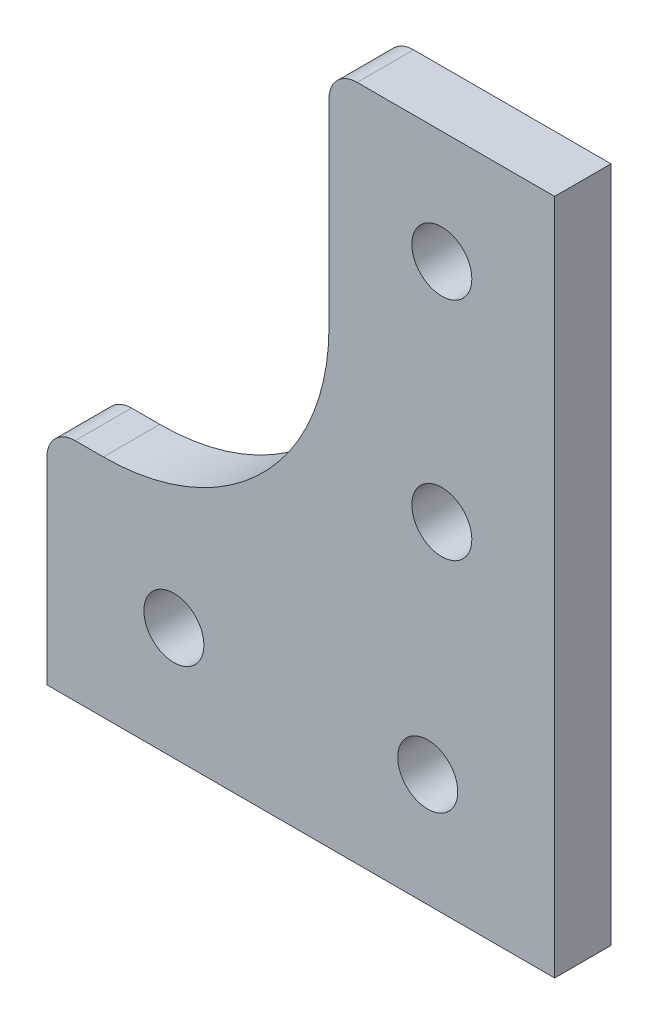
ISO-10303-21;
HEADER;
FILE_DESCRIPTION(('STEP AP214'),'2;1');
FILE_NAME('part.step','',(''),(''),'','','');
FILE_SCHEMA(('AUTOMOTIVE_DESIGN { 1 0 10303 214 1 1 1 1 }'));
ENDSEC;
DATA;
#1=APPLICATION_CONTEXT('core data for automotive mechanical design processes');
#2=APPLICATION_PROTOCOL_DEFINITION('international standard','automotive_design',2000,#1);
#3=PRODUCT_CONTEXT('',#1,'mechanical');
#4=PRODUCT('Part','Part','',(#3));
#5=PRODUCT_RELATED_PRODUCT_CATEGORY('part','',(#4));
#6=PRODUCT_DEFINITION_FORMATION('','',#4);
#7=PRODUCT_DEFINITION_CONTEXT('part definition',#1,'design');
#8=PRODUCT_DEFINITION('design','',#6,#7);
#9=PRODUCT_DEFINITION_SHAPE('','',#8);
#10=(LENGTH_UNIT() NAMED_UNIT(*) SI_UNIT(.MILLI.,.METRE.));
#11=(NAMED_UNIT(*) PLANE_ANGLE_UNIT() SI_UNIT($,.RADIAN.));
#12=(NAMED_UNIT(*) SI_UNIT($,.STERADIAN.) SOLID_ANGLE_UNIT());
#13=UNCERTAINTY_MEASURE_WITH_UNIT(LENGTH_MEASURE(1.E-05),#10,'distance_accuracy_value','');
#14=(GEOMETRIC_REPRESENTATION_CONTEXT(3) GLOBAL_UNCERTAINTY_ASSIGNED_CONTEXT((#13)) GLOBAL_UNIT_ASSIGNED_CONTEXT((#10,
#11,#12)) REPRESENTATION_CONTEXT('',''));
#15=CARTESIAN_POINT('',(0.,0.,0.));
#16=DIRECTION('',(0.,0.,1.));
#17=DIRECTION('',(1.,0.,0.));
#18=AXIS2_PLACEMENT_3D('',#15,#16,#17);
#19=CARTESIAN_POINT('',(-28.575,12.7,3.175));
#20=DIRECTION('',(1.,0.,0.));
#21=DIRECTION('',(0.,0.,-1.));
#22=AXIS2_PLACEMENT_3D('',#19,#20,#21);
#23=PLANE('',#22);
#24=DIRECTION('',(0.,-1.,0.));
#25=VECTOR('',#24,1.);
#26=CARTESIAN_POINT('',(-28.575,12.7,3.175));
#27=LINE('',#26,#25);
#28=CARTESIAN_POINT('',(-28.575,9.525,3.175));
#29=VERTEX_POINT('',#28);
#30=CARTESIAN_POINT('',(-28.575,-12.7,3.175));
#31=VERTEX_POINT('',#30);
#32=EDGE_CURVE('E110',#29,#31,#27,.T.);
#33=ORIENTED_EDGE('',*,*,#32,.F.);
#34=DIRECTION('',(0.,0.,-1.));
#35=VECTOR('',#34,1.);
#36=CARTESIAN_POINT('',(-28.575,9.525,3.175));
#37=LINE('',#36,#35);
#38=CARTESIAN_POINT('',(-28.575,9.525,-3.175));
#39=VERTEX_POINT('',#38);
#40=EDGE_CURVE('E152',#29,#39,#37,.T.);
#41=ORIENTED_EDGE('',*,*,#40,.T.);
#42=DIRECTION('',(0.,-1.,0.));
#43=VECTOR('',#42,1.);
#44=CARTESIAN_POINT('',(-28.575,12.7,-3.175));
#45=LINE('',#44,#43);
#46=CARTESIAN_POINT('',(-28.575,-12.7,-3.175));
#47=VERTEX_POINT('',#46);
#48=EDGE_CURVE('E134',#39,#47,#45,.T.);
#49=ORIENTED_EDGE('',*,*,#48,.T.);
#50=DIRECTION('',(0.,0.,-1.));
#51=VECTOR('',#50,1.);
#52=CARTESIAN_POINT('',(-28.575,-12.7,3.175));
#53=LINE('',#52,#51);
#54=EDGE_CURVE('E127',#31,#47,#53,.T.);
#55=ORIENTED_EDGE('',*,*,#54,.F.);
#56=EDGE_LOOP('',(#33,#41,#49,#55));
#57=FACE_BOUND('',#56,.T.);
#58=ADVANCED_FACE('F41',(#57),#23,.F.);
#59=CARTESIAN_POINT('',(-28.575,-12.7,3.175));
#60=DIRECTION('',(0.,1.,0.));
#61=DIRECTION('',(0.,0.,1.));
#62=AXIS2_PLACEMENT_3D('',#59,#60,#61);
#63=PLANE('',#62);
#64=DIRECTION('',(1.,0.,0.));
#65=VECTOR('',#64,1.);
#66=CARTESIAN_POINT('',(-28.575,-12.7,-3.175));
#67=LINE('',#66,#65);
#68=CARTESIAN_POINT('',(28.575,-12.7,-3.175));
#69=VERTEX_POINT('',#68);
#70=EDGE_CURVE('E191',#47,#69,#67,.T.);
#71=ORIENTED_EDGE('',*,*,#70,.T.);
#72=DIRECTION('',(0.,0.,-1.));
#73=VECTOR('',#72,1.);
#74=CARTESIAN_POINT('',(28.575,-12.7,3.175));
#75=LINE('',#74,#73);
#76=CARTESIAN_POINT('',(28.575,-12.7,3.175));
#77=VERTEX_POINT('',#76);
#78=EDGE_CURVE('E129',#77,#69,#75,.T.);
#79=ORIENTED_EDGE('',*,*,#78,.F.);
#80=DIRECTION('',(1.,0.,0.));
#81=VECTOR('',#80,1.);
#82=CARTESIAN_POINT('',(-28.575,-12.7,3.175));
#83=LINE('',#82,#81);
#84=EDGE_CURVE('E114',#31,#77,#83,.T.);
#85=ORIENTED_EDGE('',*,*,#84,.F.);
#86=ORIENTED_EDGE('',*,*,#54,.T.);
#87=EDGE_LOOP('',(#71,#79,#85,#86));
#88=FACE_BOUND('',#87,.T.);
#89=ADVANCED_FACE('F126',(#88),#63,.F.);
#90=CARTESIAN_POINT('',(28.575,-12.7,3.175));
#91=DIRECTION('',(-1.,0.,0.));
#92=DIRECTION('',(0.,-1.,0.));
#93=AXIS2_PLACEMENT_3D('',#90,#91,#92);
#94=PLANE('',#93);
#95=DIRECTION('',(0.,1.,0.));
#96=VECTOR('',#95,1.);
#97=CARTESIAN_POINT('',(28.575,-12.7,-3.175));
#98=LINE('',#97,#96);
#99=CARTESIAN_POINT('',(28.575,63.5,-3.175));
#100=VERTEX_POINT('',#99);
#101=EDGE_CURVE('E178',#69,#100,#98,.T.);
#102=ORIENTED_EDGE('',*,*,#101,.T.);
#103=DIRECTION('',(0.,0.,-1.));
#104=VECTOR('',#103,1.);
#105=CARTESIAN_POINT('',(28.575,63.5,3.175));
#106=LINE('',#105,#104);
#107=CARTESIAN_POINT('',(28.575,63.5,3.175));
#108=VERTEX_POINT('',#107);
#109=EDGE_CURVE('E141',#108,#100,#106,.T.);
#110=ORIENTED_EDGE('',*,*,#109,.F.);
#111=DIRECTION('',(0.,1.,0.));
#112=VECTOR('',#111,1.);
#113=CARTESIAN_POINT('',(28.575,-12.7,3.175));
#114=LINE('',#113,#112);
#115=EDGE_CURVE('E131',#77,#108,#114,.T.);
#116=ORIENTED_EDGE('',*,*,#115,.F.);
#117=ORIENTED_EDGE('',*,*,#78,.T.);
#118=EDGE_LOOP('',(#102,#110,#116,#117));
#119=FACE_BOUND('',#118,.T.);
#120=ADVANCED_FACE('F195',(#119),#94,.F.);
#121=CARTESIAN_POINT('',(28.575,63.5,3.175));
#122=DIRECTION('',(0.,-1.,0.));
#123=DIRECTION('',(0.,0.,-1.));
#124=AXIS2_PLACEMENT_3D('',#121,#122,#123);
#125=PLANE('',#124);
#126=DIRECTION('',(-1.,0.,0.));
#127=VECTOR('',#126,1.);
#128=CARTESIAN_POINT('',(28.575,63.5,-3.175));
#129=LINE('',#128,#127);
#130=CARTESIAN_POINT('',(6.35,63.5,-3.175));
#131=VERTEX_POINT('',#130);
#132=EDGE_CURVE('E174',#100,#131,#129,.T.);
#133=ORIENTED_EDGE('',*,*,#132,.T.);
#134=DIRECTION('',(0.,0.,-1.));
#135=VECTOR('',#134,1.);
#136=CARTESIAN_POINT('',(6.35,63.5,3.175));
#137=LINE('',#136,#135);
#138=CARTESIAN_POINT('',(6.35,63.5,3.175));
#139=VERTEX_POINT('',#138);
#140=EDGE_CURVE('E11',#131,#139,#137,.F.);
#141=ORIENTED_EDGE('',*,*,#140,.T.);
#142=DIRECTION('',(-1.,0.,0.));
#143=VECTOR('',#142,1.);
#144=CARTESIAN_POINT('',(28.575,63.5,3.175));
#145=LINE('',#144,#143);
#146=EDGE_CURVE('E186',#108,#139,#145,.T.);
#147=ORIENTED_EDGE('',*,*,#146,.F.);
#148=ORIENTED_EDGE('',*,*,#109,.T.);
#149=EDGE_LOOP('',(#133,#141,#147,#148));
#150=FACE_BOUND('',#149,.T.);
#151=ADVANCED_FACE('F196',(#150),#125,.F.);
#152=CARTESIAN_POINT('',(3.175,63.5,3.175));
#153=DIRECTION('',(1.,0.,0.));
#154=DIRECTION('',(0.,1.,0.));
#155=AXIS2_PLACEMENT_3D('',#152,#153,#154);
#156=PLANE('',#155);
#157=DIRECTION('',(0.,-1.,0.));
#158=VECTOR('',#157,1.);
#159=CARTESIAN_POINT('',(3.175,63.5,3.175));
#160=LINE('',#159,#158);
#161=CARTESIAN_POINT('',(3.175,60.325,3.175));
#162=VERTEX_POINT('',#161);
#163=CARTESIAN_POINT('',(3.175,38.1,3.175));
#164=VERTEX_POINT('',#163);
#165=EDGE_CURVE('E167',#162,#164,#160,.T.);
#166=ORIENTED_EDGE('',*,*,#165,.F.);
#167=DIRECTION('',(0.,0.,-1.));
#168=VECTOR('',#167,1.);
#169=CARTESIAN_POINT('',(3.175,60.325,3.175));
#170=LINE('',#169,#168);
#171=CARTESIAN_POINT('',(3.175,60.325,-3.175));
#172=VERTEX_POINT('',#171);
#173=EDGE_CURVE('E49',#162,#172,#170,.T.);
#174=ORIENTED_EDGE('',*,*,#173,.T.);
#175=DIRECTION('',(0.,-1.,0.));
#176=VECTOR('',#175,1.);
#177=CARTESIAN_POINT('',(3.175,63.5,-3.175));
#178=LINE('',#177,#176);
#179=CARTESIAN_POINT('',(3.175,38.1,-3.175));
#180=VERTEX_POINT('',#179);
#181=EDGE_CURVE('E166',#172,#180,#178,.T.);
#182=ORIENTED_EDGE('',*,*,#181,.T.);
#183=DIRECTION('',(0.,0.,-1.));
#184=VECTOR('',#183,1.);
#185=CARTESIAN_POINT('',(3.175,38.1,3.175));
#186=LINE('',#185,#184);
#187=EDGE_CURVE('E139',#180,#164,#186,.F.);
#188=ORIENTED_EDGE('',*,*,#187,.T.);
#189=EDGE_LOOP('',(#166,#174,#182,#188));
#190=FACE_BOUND('',#189,.T.);
#191=ADVANCED_FACE('F165',(#190),#156,.F.);
#192=CARTESIAN_POINT('',(3.17500000000001,12.7,3.175));
#193=DIRECTION('',(0.,-1.,0.));
#194=DIRECTION('',(0.,0.,-1.));
#195=AXIS2_PLACEMENT_3D('',#192,#193,#194);
#196=PLANE('',#195);
#197=DIRECTION('',(-1.,0.,0.));
#198=VECTOR('',#197,1.);
#199=CARTESIAN_POINT('',(3.17500000000001,12.7,-3.175));
#200=LINE('',#199,#198);
#201=CARTESIAN_POINT('',(-22.225,12.7,-3.175));
#202=VERTEX_POINT('',#201);
#203=CARTESIAN_POINT('',(-25.4,12.7,-3.175));
#204=VERTEX_POINT('',#203);
#205=EDGE_CURVE('E122',#202,#204,#200,.T.);
#206=ORIENTED_EDGE('',*,*,#205,.T.);
#207=DIRECTION('',(0.,0.,-1.));
#208=VECTOR('',#207,1.);
#209=CARTESIAN_POINT('',(-25.4,12.7,3.175));
#210=LINE('',#209,#208);
#211=CARTESIAN_POINT('',(-25.4,12.7,3.175));
#212=VERTEX_POINT('',#211);
#213=EDGE_CURVE('E158',#204,#212,#210,.F.);
#214=ORIENTED_EDGE('',*,*,#213,.T.);
#215=DIRECTION('',(-1.,0.,0.));
#216=VECTOR('',#215,1.);
#217=CARTESIAN_POINT('',(3.17500000000001,12.7,3.175));
#218=LINE('',#217,#216);
#219=CARTESIAN_POINT('',(-22.225,12.7,3.175));
#220=VERTEX_POINT('',#219);
#221=EDGE_CURVE('E182',#220,#212,#218,.T.);
#222=ORIENTED_EDGE('',*,*,#221,.F.);
#223=DIRECTION('',(0.,0.,-1.));
#224=VECTOR('',#223,1.);
#225=CARTESIAN_POINT('',(-22.225,12.7,-3.175));
#226=LINE('',#225,#224);
#227=EDGE_CURVE('E136',#220,#202,#226,.T.);
#228=ORIENTED_EDGE('',*,*,#227,.T.);
#229=EDGE_LOOP('',(#206,#214,#222,#228));
#230=FACE_BOUND('',#229,.T.);
#231=ADVANCED_FACE('F225',(#230),#196,.F.);
#232=CARTESIAN_POINT('',(0.,0.,3.175));
#233=DIRECTION('',(0.,0.,1.));
#234=DIRECTION('',(1.,0.,0.));
#235=AXIS2_PLACEMENT_3D('',#232,#233,#234);
#236=PLANE('',#235);
#237=CARTESIAN_POINT('',(-14.2875,0.,3.175));
#238=DIRECTION('',(0.,0.,1.));
#239=DIRECTION('',(1.,0.,0.));
#240=AXIS2_PLACEMENT_3D('',#237,#238,#239);
#241=CIRCLE('',#240,3.3782);
#242=CARTESIAN_POINT('',(-10.9093,0.,3.175));
#243=VERTEX_POINT('',#242);
#244=EDGE_CURVE('E328',#243,#243,#241,.T.);
#245=ORIENTED_EDGE('',*,*,#244,.F.);
#246=EDGE_LOOP('',(#245));
#247=FACE_BOUND('',#246,.T.);
#248=CARTESIAN_POINT('',(14.2875,0.,3.175));
#249=DIRECTION('',(0.,0.,1.));
#250=DIRECTION('',(1.,0.,0.));
#251=AXIS2_PLACEMENT_3D('',#248,#249,#250);
#252=CIRCLE('',#251,3.37819999999999);
#253=CARTESIAN_POINT('',(17.6657,0.,3.175));
#254=VERTEX_POINT('',#253);
#255=EDGE_CURVE('E324',#254,#254,#252,.T.);
#256=ORIENTED_EDGE('',*,*,#255,.F.);
#257=EDGE_LOOP('',(#256));
#258=FACE_BOUND('',#257,.T.);
#259=CARTESIAN_POINT('',(15.8750000000001,25.4000000000013,3.175));
#260=DIRECTION('',(0.,0.,1.));
#261=DIRECTION('',(1.,0.,0.));
#262=AXIS2_PLACEMENT_3D('',#259,#260,#261);
#263=CIRCLE('',#262,3.37819999999945);
#264=CARTESIAN_POINT('',(19.2531999999995,25.4000000000013,3.175));
#265=VERTEX_POINT('',#264);
#266=EDGE_CURVE('E314',#265,#265,#263,.T.);
#267=ORIENTED_EDGE('',*,*,#266,.F.);
#268=EDGE_LOOP('',(#267));
#269=FACE_BOUND('',#268,.T.);
#270=CARTESIAN_POINT('',(15.8750000000001,50.8000000000013,3.175));
#271=DIRECTION('',(0.,0.,1.));
#272=DIRECTION('',(1.,0.,0.));
#273=AXIS2_PLACEMENT_3D('',#270,#271,#272);
#274=CIRCLE('',#273,3.37819999999945);
#275=CARTESIAN_POINT('',(19.2531999999995,50.8000000000013,3.175));
#276=VERTEX_POINT('',#275);
#277=EDGE_CURVE('E315',#276,#276,#274,.T.);
#278=ORIENTED_EDGE('',*,*,#277,.F.);
#279=EDGE_LOOP('',(#278));
#280=FACE_BOUND('',#279,.T.);
#281=ORIENTED_EDGE('',*,*,#221,.T.);
#282=CARTESIAN_POINT('',(-25.4,9.525,3.175));
#283=DIRECTION('',(0.,0.,1.));
#284=DIRECTION('',(1.,0.,0.));
#285=AXIS2_PLACEMENT_3D('',#282,#283,#284);
#286=CIRCLE('',#285,3.175);
#287=EDGE_CURVE('E117',#212,#29,#286,.T.);
#288=ORIENTED_EDGE('',*,*,#287,.T.);
#289=ORIENTED_EDGE('',*,*,#32,.T.);
#290=ORIENTED_EDGE('',*,*,#84,.T.);
#291=ORIENTED_EDGE('',*,*,#115,.T.);
#292=ORIENTED_EDGE('',*,*,#146,.T.);
#293=CARTESIAN_POINT('',(6.35,60.325,3.175));
#294=DIRECTION('',(0.,0.,1.));
#295=DIRECTION('',(1.,0.,0.));
#296=AXIS2_PLACEMENT_3D('',#293,#294,#295);
#297=CIRCLE('',#296,3.175);
#298=EDGE_CURVE('E56',#139,#162,#297,.T.);
#299=ORIENTED_EDGE('',*,*,#298,.T.);
#300=ORIENTED_EDGE('',*,*,#165,.T.);
#301=CARTESIAN_POINT('',(-22.225,38.1,3.175));
#302=DIRECTION('',(0.,0.,1.));
#303=DIRECTION('',(1.,0.,0.));
#304=AXIS2_PLACEMENT_3D('',#301,#302,#303);
#305=CIRCLE('',#304,25.4);
#306=EDGE_CURVE('E150',#164,#220,#305,.F.);
#307=ORIENTED_EDGE('',*,*,#306,.T.);
#308=EDGE_LOOP('',(#281,#288,#289,#290,#291,#292,#299,#300,#307));
#309=FACE_BOUND('',#308,.T.);
#310=ADVANCED_FACE('F113',(#247,#258,#269,#280,#309),#236,.T.);
#311=CARTESIAN_POINT('',(0.,0.,-3.175));
#312=DIRECTION('',(0.,0.,1.));
#313=DIRECTION('',(1.,0.,0.));
#314=AXIS2_PLACEMENT_3D('',#311,#312,#313);
#315=PLANE('',#314);
#316=CARTESIAN_POINT('',(-14.2875,0.,-3.175));
#317=DIRECTION('',(0.,0.,1.));
#318=DIRECTION('',(1.,0.,0.));
#319=AXIS2_PLACEMENT_3D('',#316,#317,#318);
#320=CIRCLE('',#319,3.3782);
#321=CARTESIAN_POINT('',(-10.9093,0.,-3.175));
#322=VERTEX_POINT('',#321);
#323=EDGE_CURVE('E303',#322,#322,#320,.T.);
#324=ORIENTED_EDGE('',*,*,#323,.T.);
#325=EDGE_LOOP('',(#324));
#326=FACE_BOUND('',#325,.T.);
#327=CARTESIAN_POINT('',(14.2875,0.,-3.175));
#328=DIRECTION('',(0.,0.,1.));
#329=DIRECTION('',(1.,0.,0.));
#330=AXIS2_PLACEMENT_3D('',#327,#328,#329);
#331=CIRCLE('',#330,3.37819999999999);
#332=CARTESIAN_POINT('',(17.6657,0.,-3.175));
#333=VERTEX_POINT('',#332);
#334=EDGE_CURVE('E307',#333,#333,#331,.T.);
#335=ORIENTED_EDGE('',*,*,#334,.T.);
#336=EDGE_LOOP('',(#335));
#337=FACE_BOUND('',#336,.T.);
#338=CARTESIAN_POINT('',(15.8750000000001,25.4000000000013,-3.175));
#339=DIRECTION('',(0.,0.,1.));
#340=DIRECTION('',(1.,0.,0.));
#341=AXIS2_PLACEMENT_3D('',#338,#339,#340);
#342=CIRCLE('',#341,3.37819999999945);
#343=CARTESIAN_POINT('',(19.2531999999995,25.4000000000013,-3.175));
#344=VERTEX_POINT('',#343);
#345=EDGE_CURVE('E192',#344,#344,#342,.T.);
#346=ORIENTED_EDGE('',*,*,#345,.T.);
#347=EDGE_LOOP('',(#346));
#348=FACE_BOUND('',#347,.T.);
#349=CARTESIAN_POINT('',(15.8750000000001,50.8000000000013,-3.175));
#350=DIRECTION('',(0.,0.,1.));
#351=DIRECTION('',(1.,0.,0.));
#352=AXIS2_PLACEMENT_3D('',#349,#350,#351);
#353=CIRCLE('',#352,3.37819999999945);
#354=CARTESIAN_POINT('',(19.2531999999995,50.8000000000013,-3.175));
#355=VERTEX_POINT('',#354);
#356=EDGE_CURVE('E313',#355,#355,#353,.T.);
#357=ORIENTED_EDGE('',*,*,#356,.T.);
#358=EDGE_LOOP('',(#357));
#359=FACE_BOUND('',#358,.T.);
#360=ORIENTED_EDGE('',*,*,#48,.F.);
#361=CARTESIAN_POINT('',(-25.4,9.525,-3.175));
#362=DIRECTION('',(0.,0.,1.));
#363=DIRECTION('',(1.,0.,0.));
#364=AXIS2_PLACEMENT_3D('',#361,#362,#363);
#365=CIRCLE('',#364,3.175);
#366=EDGE_CURVE('E156',#39,#204,#365,.F.);
#367=ORIENTED_EDGE('',*,*,#366,.T.);
#368=ORIENTED_EDGE('',*,*,#205,.F.);
#369=CARTESIAN_POINT('',(-22.225,38.1,-3.175));
#370=DIRECTION('',(0.,0.,1.));
#371=DIRECTION('',(1.,0.,0.));
#372=AXIS2_PLACEMENT_3D('',#369,#370,#371);
#373=CIRCLE('',#372,25.4);
#374=EDGE_CURVE('E147',#202,#180,#373,.T.);
#375=ORIENTED_EDGE('',*,*,#374,.T.);
#376=ORIENTED_EDGE('',*,*,#181,.F.);
#377=CARTESIAN_POINT('',(6.35,60.325,-3.175));
#378=DIRECTION('',(0.,0.,1.));
#379=DIRECTION('',(1.,0.,0.));
#380=AXIS2_PLACEMENT_3D('',#377,#378,#379);
#381=CIRCLE('',#380,3.175);
#382=EDGE_CURVE('E154',#172,#131,#381,.F.);
#383=ORIENTED_EDGE('',*,*,#382,.T.);
#384=ORIENTED_EDGE('',*,*,#132,.F.);
#385=ORIENTED_EDGE('',*,*,#101,.F.);
#386=ORIENTED_EDGE('',*,*,#70,.F.);
#387=EDGE_LOOP('',(#360,#367,#368,#375,#376,#383,#384,#385,#386));
#388=FACE_BOUND('',#387,.T.);
#389=ADVANCED_FACE('F170',(#326,#337,#348,#359,#388),#315,.F.);
#390=CARTESIAN_POINT('',(15.8750000000001,50.8000000000013,-3.175));
#391=DIRECTION('',(0.,0.,1.));
#392=DIRECTION('',(1.,0.,0.));
#393=AXIS2_PLACEMENT_3D('',#390,#391,#392);
#394=CYLINDRICAL_SURFACE('',#393,3.37819999999945);
#395=ORIENTED_EDGE('',*,*,#356,.F.);
#396=EDGE_LOOP('',(#395));
#397=FACE_BOUND('',#396,.T.);
#398=ORIENTED_EDGE('',*,*,#277,.T.);
#399=EDGE_LOOP('',(#398));
#400=FACE_BOUND('',#399,.T.);
#401=ADVANCED_FACE('F247',(#397,#400),#394,.F.);
#402=CARTESIAN_POINT('',(15.8750000000001,25.4000000000013,-3.175));
#403=DIRECTION('',(0.,0.,1.));
#404=DIRECTION('',(1.,0.,0.));
#405=AXIS2_PLACEMENT_3D('',#402,#403,#404);
#406=CYLINDRICAL_SURFACE('',#405,3.37819999999945);
#407=ORIENTED_EDGE('',*,*,#345,.F.);
#408=EDGE_LOOP('',(#407));
#409=FACE_BOUND('',#408,.T.);
#410=ORIENTED_EDGE('',*,*,#266,.T.);
#411=EDGE_LOOP('',(#410));
#412=FACE_BOUND('',#411,.T.);
#413=ADVANCED_FACE('F251',(#409,#412),#406,.F.);
#414=CARTESIAN_POINT('',(14.2875,0.,-3.175));
#415=DIRECTION('',(0.,0.,1.));
#416=DIRECTION('',(1.,0.,0.));
#417=AXIS2_PLACEMENT_3D('',#414,#415,#416);
#418=CYLINDRICAL_SURFACE('',#417,3.37819999999999);
#419=ORIENTED_EDGE('',*,*,#334,.F.);
#420=EDGE_LOOP('',(#419));
#421=FACE_BOUND('',#420,.T.);
#422=ORIENTED_EDGE('',*,*,#255,.T.);
#423=EDGE_LOOP('',(#422));
#424=FACE_BOUND('',#423,.T.);
#425=ADVANCED_FACE('F219',(#421,#424),#418,.F.);
#426=CARTESIAN_POINT('',(-14.2875,0.,-3.175));
#427=DIRECTION('',(0.,0.,1.));
#428=DIRECTION('',(1.,0.,0.));
#429=AXIS2_PLACEMENT_3D('',#426,#427,#428);
#430=CYLINDRICAL_SURFACE('',#429,3.3782);
#431=ORIENTED_EDGE('',*,*,#323,.F.);
#432=EDGE_LOOP('',(#431));
#433=FACE_BOUND('',#432,.T.);
#434=ORIENTED_EDGE('',*,*,#244,.T.);
#435=EDGE_LOOP('',(#434));
#436=FACE_BOUND('',#435,.T.);
#437=ADVANCED_FACE('F214',(#433,#436),#430,.F.);
#438=CARTESIAN_POINT('',(-22.225,38.1,3.175));
#439=DIRECTION('',(0.,0.,1.));
#440=DIRECTION('',(1.,0.,0.));
#441=AXIS2_PLACEMENT_3D('',#438,#439,#440);
#442=CYLINDRICAL_SURFACE('',#441,25.4);
#443=ORIENTED_EDGE('',*,*,#306,.F.);
#444=ORIENTED_EDGE('',*,*,#187,.F.);
#445=ORIENTED_EDGE('',*,*,#374,.F.);
#446=ORIENTED_EDGE('',*,*,#227,.F.);
#447=EDGE_LOOP('',(#443,#444,#445,#446));
#448=FACE_BOUND('',#447,.T.);
#449=ADVANCED_FACE('F202',(#448),#442,.F.);
#450=CARTESIAN_POINT('',(-25.4,9.525,3.175));
#451=DIRECTION('',(0.,0.,-1.));
#452=DIRECTION('',(-1.,0.,0.));
#453=AXIS2_PLACEMENT_3D('',#450,#451,#452);
#454=CYLINDRICAL_SURFACE('',#453,3.175);
#455=ORIENTED_EDGE('',*,*,#287,.F.);
#456=ORIENTED_EDGE('',*,*,#213,.F.);
#457=ORIENTED_EDGE('',*,*,#366,.F.);
#458=ORIENTED_EDGE('',*,*,#40,.F.);
#459=EDGE_LOOP('',(#455,#456,#457,#458));
#460=FACE_BOUND('',#459,.T.);
#461=ADVANCED_FACE('F198',(#460),#454,.T.);
#462=CARTESIAN_POINT('',(6.35,60.325,3.175));
#463=DIRECTION('',(0.,0.,-1.));
#464=DIRECTION('',(-1.,0.,0.));
#465=AXIS2_PLACEMENT_3D('',#462,#463,#464);
#466=CYLINDRICAL_SURFACE('',#465,3.175);
#467=ORIENTED_EDGE('',*,*,#298,.F.);
#468=ORIENTED_EDGE('',*,*,#140,.F.);
#469=ORIENTED_EDGE('',*,*,#382,.F.);
#470=ORIENTED_EDGE('',*,*,#173,.F.);
#471=EDGE_LOOP('',(#467,#468,#469,#470));
#472=FACE_BOUND('',#471,.T.);
#473=ADVANCED_FACE('F43',(#472),#466,.T.);
#474=CLOSED_SHELL('',(#58,#89,#120,#151,#191,#231,#310,#389,#401,#413,#425,#437,#449,#461,#473));
#475=MANIFOLD_SOLID_BREP('B2',#474);
#476=ADVANCED_BREP_SHAPE_REPRESENTATION('',(#18,#475),#14);
#477=SHAPE_DEFINITION_REPRESENTATION(#9,#476);
ENDSEC;
END-ISO-10303-21;
